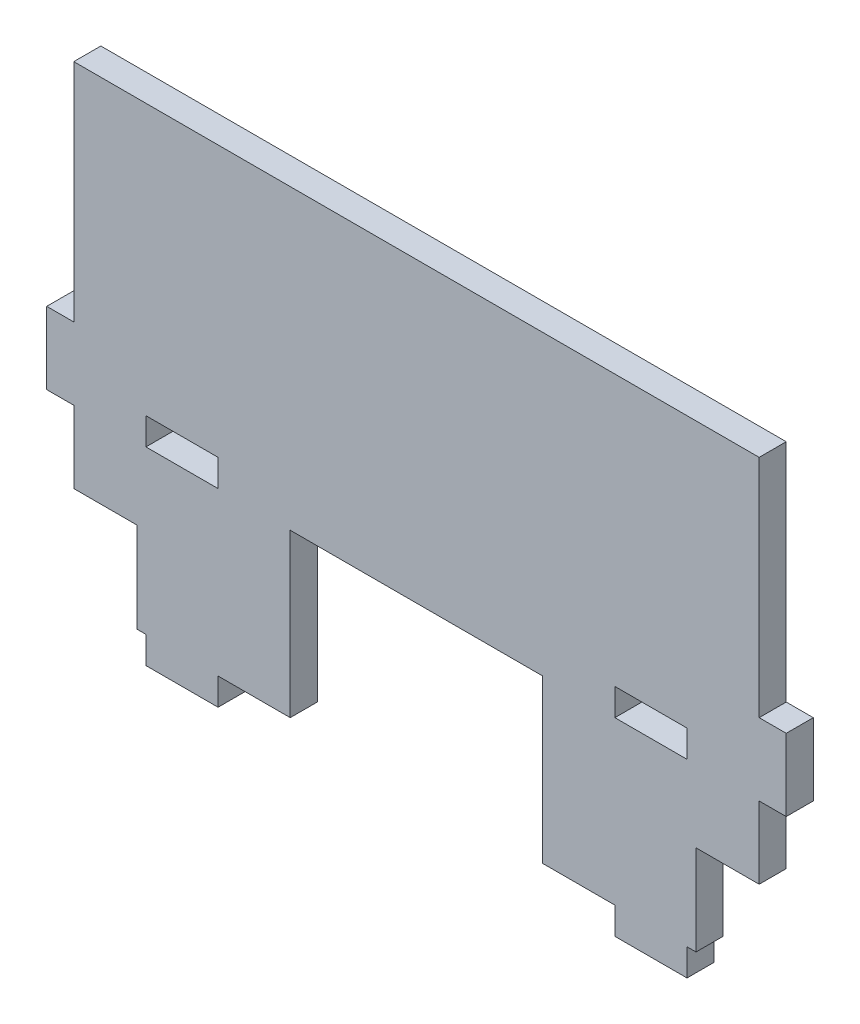
ISO-10303-21;
HEADER;
FILE_DESCRIPTION(('STEP AP214'),'2;1');
FILE_NAME('part.step','',(''),(''),'','','');
FILE_SCHEMA(('AUTOMOTIVE_DESIGN { 1 0 10303 214 1 1 1 1 }'));
ENDSEC;
DATA;
#1=APPLICATION_CONTEXT('core data for automotive mechanical design processes');
#2=APPLICATION_PROTOCOL_DEFINITION('international standard','automotive_design',2000,#1);
#3=PRODUCT_CONTEXT('',#1,'mechanical');
#4=PRODUCT('Part','Part','',(#3));
#5=PRODUCT_RELATED_PRODUCT_CATEGORY('part','',(#4));
#6=PRODUCT_DEFINITION_FORMATION('','',#4);
#7=PRODUCT_DEFINITION_CONTEXT('part definition',#1,'design');
#8=PRODUCT_DEFINITION('design','',#6,#7);
#9=PRODUCT_DEFINITION_SHAPE('','',#8);
#10=(LENGTH_UNIT() NAMED_UNIT(*) SI_UNIT(.MILLI.,.METRE.));
#11=(NAMED_UNIT(*) PLANE_ANGLE_UNIT() SI_UNIT($,.RADIAN.));
#12=(NAMED_UNIT(*) SI_UNIT($,.STERADIAN.) SOLID_ANGLE_UNIT());
#13=UNCERTAINTY_MEASURE_WITH_UNIT(LENGTH_MEASURE(1.E-05),#10,'distance_accuracy_value','');
#14=(GEOMETRIC_REPRESENTATION_CONTEXT(3) GLOBAL_UNCERTAINTY_ASSIGNED_CONTEXT((#13)) GLOBAL_UNIT_ASSIGNED_CONTEXT((#10,
#11,#12)) REPRESENTATION_CONTEXT('',''));
#15=CARTESIAN_POINT('',(0.,0.,0.));
#16=DIRECTION('',(0.,0.,1.));
#17=DIRECTION('',(1.,0.,0.));
#18=AXIS2_PLACEMENT_3D('',#15,#16,#17);
#19=CARTESIAN_POINT('',(0.,0.,3.));
#20=DIRECTION('',(0.,0.,-1.));
#21=DIRECTION('',(-1.,0.,0.));
#22=AXIS2_PLACEMENT_3D('',#19,#20,#21);
#23=PLANE('',#22);
#24=DIRECTION('',(1.,0.,0.));
#25=VECTOR('',#24,1.);
#26=CARTESIAN_POINT('',(30.,-33.,3.));
#27=LINE('',#26,#25);
#28=CARTESIAN_POINT('',(22.,-33.,3.));
#29=VERTEX_POINT('',#28);
#30=CARTESIAN_POINT('',(30.,-33.,3.));
#31=VERTEX_POINT('',#30);
#32=EDGE_CURVE('E301',#29,#31,#27,.T.);
#33=ORIENTED_EDGE('',*,*,#32,.F.);
#34=DIRECTION('',(0.,-1.,0.));
#35=VECTOR('',#34,1.);
#36=CARTESIAN_POINT('',(22.,-33.,3.));
#37=LINE('',#36,#35);
#38=CARTESIAN_POINT('',(22.,-30.,3.));
#39=VERTEX_POINT('',#38);
#40=EDGE_CURVE('E309',#39,#29,#37,.T.);
#41=ORIENTED_EDGE('',*,*,#40,.F.);
#42=DIRECTION('',(-1.,0.,0.));
#43=VECTOR('',#42,1.);
#44=CARTESIAN_POINT('',(30.,-30.,3.));
#45=LINE('',#44,#43);
#46=CARTESIAN_POINT('',(30.,-30.,3.));
#47=VERTEX_POINT('',#46);
#48=EDGE_CURVE('E306',#47,#39,#45,.T.);
#49=ORIENTED_EDGE('',*,*,#48,.F.);
#50=DIRECTION('',(0.,1.,0.));
#51=VECTOR('',#50,1.);
#52=CARTESIAN_POINT('',(30.,-33.,3.));
#53=LINE('',#52,#51);
#54=EDGE_CURVE('E303',#31,#47,#53,.T.);
#55=ORIENTED_EDGE('',*,*,#54,.F.);
#56=EDGE_LOOP('',(#33,#41,#49,#55));
#57=FACE_BOUND('',#56,.T.);
#58=DIRECTION('',(0.,-1.,0.));
#59=VECTOR('',#58,1.);
#60=CARTESIAN_POINT('',(-38.,0.,3.));
#61=LINE('',#60,#59);
#62=CARTESIAN_POINT('',(-38.,0.,3.));
#63=VERTEX_POINT('',#62);
#64=CARTESIAN_POINT('',(-38.,-25.,3.));
#65=VERTEX_POINT('',#64);
#66=EDGE_CURVE('E332',#63,#65,#61,.T.);
#67=ORIENTED_EDGE('',*,*,#66,.T.);
#68=DIRECTION('',(-1.,0.,0.));
#69=VECTOR('',#68,1.);
#70=CARTESIAN_POINT('',(-38.,-25.,3.));
#71=LINE('',#70,#69);
#72=CARTESIAN_POINT('',(-41.,-25.,3.));
#73=VERTEX_POINT('',#72);
#74=EDGE_CURVE('E335',#65,#73,#71,.T.);
#75=ORIENTED_EDGE('',*,*,#74,.T.);
#76=DIRECTION('',(0.,-1.,0.));
#77=VECTOR('',#76,1.);
#78=CARTESIAN_POINT('',(-41.,-25.,3.));
#79=LINE('',#78,#77);
#80=CARTESIAN_POINT('',(-41.,-33.,3.));
#81=VERTEX_POINT('',#80);
#82=EDGE_CURVE('E338',#73,#81,#79,.T.);
#83=ORIENTED_EDGE('',*,*,#82,.T.);
#84=DIRECTION('',(1.,0.,0.));
#85=VECTOR('',#84,1.);
#86=CARTESIAN_POINT('',(-41.,-33.,3.));
#87=LINE('',#86,#85);
#88=CARTESIAN_POINT('',(-38.,-33.,3.));
#89=VERTEX_POINT('',#88);
#90=EDGE_CURVE('E340',#81,#89,#87,.T.);
#91=ORIENTED_EDGE('',*,*,#90,.T.);
#92=DIRECTION('',(0.,-1.,0.));
#93=VECTOR('',#92,1.);
#94=CARTESIAN_POINT('',(-38.,-33.,3.));
#95=LINE('',#94,#93);
#96=CARTESIAN_POINT('',(-38.,-41.,3.));
#97=VERTEX_POINT('',#96);
#98=EDGE_CURVE('E342',#89,#97,#95,.T.);
#99=ORIENTED_EDGE('',*,*,#98,.T.);
#100=DIRECTION('',(1.,0.,0.));
#101=VECTOR('',#100,1.);
#102=CARTESIAN_POINT('',(-38.,-41.,3.));
#103=LINE('',#102,#101);
#104=CARTESIAN_POINT('',(-31.,-41.,3.));
#105=VERTEX_POINT('',#104);
#106=EDGE_CURVE('E344',#97,#105,#103,.T.);
#107=ORIENTED_EDGE('',*,*,#106,.T.);
#108=DIRECTION('',(0.,-1.,0.));
#109=VECTOR('',#108,1.);
#110=CARTESIAN_POINT('',(-31.,-41.,3.));
#111=LINE('',#110,#109);
#112=CARTESIAN_POINT('',(-31.,-51.,3.));
#113=VERTEX_POINT('',#112);
#114=EDGE_CURVE('E346',#105,#113,#111,.T.);
#115=ORIENTED_EDGE('',*,*,#114,.T.);
#116=DIRECTION('',(1.,0.,0.));
#117=VECTOR('',#116,1.);
#118=CARTESIAN_POINT('',(-31.,-51.,3.));
#119=LINE('',#118,#117);
#120=CARTESIAN_POINT('',(-30.,-51.,3.));
#121=VERTEX_POINT('',#120);
#122=EDGE_CURVE('E348',#113,#121,#119,.T.);
#123=ORIENTED_EDGE('',*,*,#122,.T.);
#124=DIRECTION('',(0.,-1.,0.));
#125=VECTOR('',#124,1.);
#126=CARTESIAN_POINT('',(-30.,-51.,3.));
#127=LINE('',#126,#125);
#128=CARTESIAN_POINT('',(-30.,-54.,3.));
#129=VERTEX_POINT('',#128);
#130=EDGE_CURVE('E350',#121,#129,#127,.T.);
#131=ORIENTED_EDGE('',*,*,#130,.T.);
#132=DIRECTION('',(1.,0.,0.));
#133=VECTOR('',#132,1.);
#134=CARTESIAN_POINT('',(-30.,-54.,3.));
#135=LINE('',#134,#133);
#136=CARTESIAN_POINT('',(-22.,-54.,3.));
#137=VERTEX_POINT('',#136);
#138=EDGE_CURVE('E352',#129,#137,#135,.T.);
#139=ORIENTED_EDGE('',*,*,#138,.T.);
#140=DIRECTION('',(0.,1.,0.));
#141=VECTOR('',#140,1.);
#142=CARTESIAN_POINT('',(-22.,-54.,3.));
#143=LINE('',#142,#141);
#144=CARTESIAN_POINT('',(-22.,-51.,3.));
#145=VERTEX_POINT('',#144);
#146=EDGE_CURVE('E354',#137,#145,#143,.T.);
#147=ORIENTED_EDGE('',*,*,#146,.T.);
#148=DIRECTION('',(1.,0.,0.));
#149=VECTOR('',#148,1.);
#150=CARTESIAN_POINT('',(-22.,-51.,3.));
#151=LINE('',#150,#149);
#152=CARTESIAN_POINT('',(-14.,-51.,3.));
#153=VERTEX_POINT('',#152);
#154=EDGE_CURVE('E356',#145,#153,#151,.T.);
#155=ORIENTED_EDGE('',*,*,#154,.T.);
#156=DIRECTION('',(0.,1.,0.));
#157=VECTOR('',#156,1.);
#158=CARTESIAN_POINT('',(-14.,-51.,3.));
#159=LINE('',#158,#157);
#160=CARTESIAN_POINT('',(-14.,-33.,3.));
#161=VERTEX_POINT('',#160);
#162=EDGE_CURVE('E358',#153,#161,#159,.T.);
#163=ORIENTED_EDGE('',*,*,#162,.T.);
#164=DIRECTION('',(1.,0.,0.));
#165=VECTOR('',#164,1.);
#166=CARTESIAN_POINT('',(-14.,-33.,3.));
#167=LINE('',#166,#165);
#168=CARTESIAN_POINT('',(14.,-33.,3.));
#169=VERTEX_POINT('',#168);
#170=EDGE_CURVE('E360',#161,#169,#167,.T.);
#171=ORIENTED_EDGE('',*,*,#170,.T.);
#172=DIRECTION('',(0.,-1.,0.));
#173=VECTOR('',#172,1.);
#174=CARTESIAN_POINT('',(14.,-51.,3.));
#175=LINE('',#174,#173);
#176=CARTESIAN_POINT('',(14.,-51.,3.));
#177=VERTEX_POINT('',#176);
#178=EDGE_CURVE('E362',#169,#177,#175,.T.);
#179=ORIENTED_EDGE('',*,*,#178,.T.);
#180=DIRECTION('',(1.,0.,0.));
#181=VECTOR('',#180,1.);
#182=CARTESIAN_POINT('',(22.,-51.,3.));
#183=LINE('',#182,#181);
#184=CARTESIAN_POINT('',(22.,-51.,3.));
#185=VERTEX_POINT('',#184);
#186=EDGE_CURVE('E364',#177,#185,#183,.T.);
#187=ORIENTED_EDGE('',*,*,#186,.T.);
#188=DIRECTION('',(0.,-1.,0.));
#189=VECTOR('',#188,1.);
#190=CARTESIAN_POINT('',(22.,-54.,3.));
#191=LINE('',#190,#189);
#192=CARTESIAN_POINT('',(22.,-54.,3.));
#193=VERTEX_POINT('',#192);
#194=EDGE_CURVE('E366',#185,#193,#191,.T.);
#195=ORIENTED_EDGE('',*,*,#194,.T.);
#196=DIRECTION('',(1.,0.,0.));
#197=VECTOR('',#196,1.);
#198=CARTESIAN_POINT('',(30.,-54.,3.));
#199=LINE('',#198,#197);
#200=CARTESIAN_POINT('',(30.,-54.,3.));
#201=VERTEX_POINT('',#200);
#202=EDGE_CURVE('E368',#193,#201,#199,.T.);
#203=ORIENTED_EDGE('',*,*,#202,.T.);
#204=DIRECTION('',(0.,1.,0.));
#205=VECTOR('',#204,1.);
#206=CARTESIAN_POINT('',(30.,-51.,3.));
#207=LINE('',#206,#205);
#208=CARTESIAN_POINT('',(30.,-51.,3.));
#209=VERTEX_POINT('',#208);
#210=EDGE_CURVE('E370',#201,#209,#207,.T.);
#211=ORIENTED_EDGE('',*,*,#210,.T.);
#212=DIRECTION('',(1.,0.,0.));
#213=VECTOR('',#212,1.);
#214=CARTESIAN_POINT('',(31.,-51.,3.));
#215=LINE('',#214,#213);
#216=CARTESIAN_POINT('',(31.,-51.,3.));
#217=VERTEX_POINT('',#216);
#218=EDGE_CURVE('E372',#209,#217,#215,.T.);
#219=ORIENTED_EDGE('',*,*,#218,.T.);
#220=DIRECTION('',(0.,1.,0.));
#221=VECTOR('',#220,1.);
#222=CARTESIAN_POINT('',(31.,-41.,3.));
#223=LINE('',#222,#221);
#224=CARTESIAN_POINT('',(31.,-41.,3.));
#225=VERTEX_POINT('',#224);
#226=EDGE_CURVE('E374',#217,#225,#223,.T.);
#227=ORIENTED_EDGE('',*,*,#226,.T.);
#228=DIRECTION('',(1.,0.,0.));
#229=VECTOR('',#228,1.);
#230=CARTESIAN_POINT('',(38.,-41.,3.));
#231=LINE('',#230,#229);
#232=CARTESIAN_POINT('',(38.,-41.,3.));
#233=VERTEX_POINT('',#232);
#234=EDGE_CURVE('E376',#225,#233,#231,.T.);
#235=ORIENTED_EDGE('',*,*,#234,.T.);
#236=DIRECTION('',(0.,1.,0.));
#237=VECTOR('',#236,1.);
#238=CARTESIAN_POINT('',(38.,-33.,3.));
#239=LINE('',#238,#237);
#240=CARTESIAN_POINT('',(38.,-33.,3.));
#241=VERTEX_POINT('',#240);
#242=EDGE_CURVE('E378',#233,#241,#239,.T.);
#243=ORIENTED_EDGE('',*,*,#242,.T.);
#244=DIRECTION('',(1.,0.,0.));
#245=VECTOR('',#244,1.);
#246=CARTESIAN_POINT('',(41.,-33.,3.));
#247=LINE('',#246,#245);
#248=CARTESIAN_POINT('',(41.,-33.,3.));
#249=VERTEX_POINT('',#248);
#250=EDGE_CURVE('E380',#241,#249,#247,.T.);
#251=ORIENTED_EDGE('',*,*,#250,.T.);
#252=DIRECTION('',(0.,1.,0.));
#253=VECTOR('',#252,1.);
#254=CARTESIAN_POINT('',(41.,-25.,3.));
#255=LINE('',#254,#253);
#256=CARTESIAN_POINT('',(41.,-25.,3.));
#257=VERTEX_POINT('',#256);
#258=EDGE_CURVE('E382',#249,#257,#255,.T.);
#259=ORIENTED_EDGE('',*,*,#258,.T.);
#260=DIRECTION('',(-1.,0.,0.));
#261=VECTOR('',#260,1.);
#262=CARTESIAN_POINT('',(38.,-25.,3.));
#263=LINE('',#262,#261);
#264=CARTESIAN_POINT('',(38.,-25.,3.));
#265=VERTEX_POINT('',#264);
#266=EDGE_CURVE('E384',#257,#265,#263,.T.);
#267=ORIENTED_EDGE('',*,*,#266,.T.);
#268=DIRECTION('',(0.,1.,0.));
#269=VECTOR('',#268,1.);
#270=CARTESIAN_POINT('',(38.,0.,3.));
#271=LINE('',#270,#269);
#272=CARTESIAN_POINT('',(38.,0.,3.));
#273=VERTEX_POINT('',#272);
#274=EDGE_CURVE('E386',#265,#273,#271,.T.);
#275=ORIENTED_EDGE('',*,*,#274,.T.);
#276=DIRECTION('',(-1.,0.,0.));
#277=VECTOR('',#276,1.);
#278=CARTESIAN_POINT('',(38.,0.,3.));
#279=LINE('',#278,#277);
#280=EDGE_CURVE('E388',#273,#63,#279,.T.);
#281=ORIENTED_EDGE('',*,*,#280,.T.);
#282=EDGE_LOOP('',(#67,#75,#83,#91,#99,#107,#115,#123,#131,#139,#147,#155,#163,#171,#179,#187,
#195,#203,#211,#219,#227,#235,#243,#251,#259,#267,#275,#281));
#283=FACE_BOUND('',#282,.T.);
#284=DIRECTION('',(0.,-1.,0.));
#285=VECTOR('',#284,1.);
#286=CARTESIAN_POINT('',(-30.,-33.,3.));
#287=LINE('',#286,#285);
#288=CARTESIAN_POINT('',(-30.,-30.,3.));
#289=VERTEX_POINT('',#288);
#290=CARTESIAN_POINT('',(-30.,-33.,3.));
#291=VERTEX_POINT('',#290);
#292=EDGE_CURVE('E265',#289,#291,#287,.T.);
#293=ORIENTED_EDGE('',*,*,#292,.F.);
#294=DIRECTION('',(-1.,0.,0.));
#295=VECTOR('',#294,1.);
#296=CARTESIAN_POINT('',(-30.,-30.,3.));
#297=LINE('',#296,#295);
#298=CARTESIAN_POINT('',(-22.,-30.,3.));
#299=VERTEX_POINT('',#298);
#300=EDGE_CURVE('E287',#299,#289,#297,.T.);
#301=ORIENTED_EDGE('',*,*,#300,.F.);
#302=DIRECTION('',(0.,1.,0.));
#303=VECTOR('',#302,1.);
#304=CARTESIAN_POINT('',(-22.,-33.,3.));
#305=LINE('',#304,#303);
#306=CARTESIAN_POINT('',(-22.,-33.,3.));
#307=VERTEX_POINT('',#306);
#308=EDGE_CURVE('E285',#307,#299,#305,.T.);
#309=ORIENTED_EDGE('',*,*,#308,.F.);
#310=DIRECTION('',(1.,0.,0.));
#311=VECTOR('',#310,1.);
#312=CARTESIAN_POINT('',(-30.,-33.,3.));
#313=LINE('',#312,#311);
#314=EDGE_CURVE('E273',#291,#307,#313,.T.);
#315=ORIENTED_EDGE('',*,*,#314,.F.);
#316=EDGE_LOOP('',(#293,#301,#309,#315));
#317=FACE_BOUND('',#316,.T.);
#318=ADVANCED_FACE('F32',(#57,#283,#317),#23,.F.);
#319=CARTESIAN_POINT('',(0.,0.,0.));
#320=DIRECTION('',(0.,0.,-1.));
#321=DIRECTION('',(-1.,0.,0.));
#322=AXIS2_PLACEMENT_3D('',#319,#320,#321);
#323=PLANE('',#322);
#324=DIRECTION('',(0.,-1.,0.));
#325=VECTOR('',#324,1.);
#326=CARTESIAN_POINT('',(22.,-33.,0.));
#327=LINE('',#326,#325);
#328=CARTESIAN_POINT('',(22.,-30.,0.));
#329=VERTEX_POINT('',#328);
#330=CARTESIAN_POINT('',(22.,-33.,0.));
#331=VERTEX_POINT('',#330);
#332=EDGE_CURVE('E304',#329,#331,#327,.T.);
#333=ORIENTED_EDGE('',*,*,#332,.T.);
#334=DIRECTION('',(1.,0.,0.));
#335=VECTOR('',#334,1.);
#336=CARTESIAN_POINT('',(30.,-33.,0.));
#337=LINE('',#336,#335);
#338=CARTESIAN_POINT('',(30.,-33.,0.));
#339=VERTEX_POINT('',#338);
#340=EDGE_CURVE('E281',#331,#339,#337,.T.);
#341=ORIENTED_EDGE('',*,*,#340,.T.);
#342=DIRECTION('',(0.,1.,0.));
#343=VECTOR('',#342,1.);
#344=CARTESIAN_POINT('',(30.,-33.,0.));
#345=LINE('',#344,#343);
#346=CARTESIAN_POINT('',(30.,-30.,0.));
#347=VERTEX_POINT('',#346);
#348=EDGE_CURVE('E314',#339,#347,#345,.T.);
#349=ORIENTED_EDGE('',*,*,#348,.T.);
#350=DIRECTION('',(-1.,0.,0.));
#351=VECTOR('',#350,1.);
#352=CARTESIAN_POINT('',(30.,-30.,0.));
#353=LINE('',#352,#351);
#354=EDGE_CURVE('E317',#347,#329,#353,.T.);
#355=ORIENTED_EDGE('',*,*,#354,.T.);
#356=EDGE_LOOP('',(#333,#341,#349,#355));
#357=FACE_BOUND('',#356,.T.);
#358=DIRECTION('',(0.,-1.,0.));
#359=VECTOR('',#358,1.);
#360=CARTESIAN_POINT('',(-38.,0.,0.));
#361=LINE('',#360,#359);
#362=CARTESIAN_POINT('',(-38.,0.,0.));
#363=VERTEX_POINT('',#362);
#364=CARTESIAN_POINT('',(-38.,-25.,0.));
#365=VERTEX_POINT('',#364);
#366=EDGE_CURVE('E331',#363,#365,#361,.T.);
#367=ORIENTED_EDGE('',*,*,#366,.F.);
#368=DIRECTION('',(-1.,0.,0.));
#369=VECTOR('',#368,1.);
#370=CARTESIAN_POINT('',(38.,0.,0.));
#371=LINE('',#370,#369);
#372=CARTESIAN_POINT('',(38.,0.,0.));
#373=VERTEX_POINT('',#372);
#374=EDGE_CURVE('E336',#373,#363,#371,.T.);
#375=ORIENTED_EDGE('',*,*,#374,.F.);
#376=DIRECTION('',(0.,1.,0.));
#377=VECTOR('',#376,1.);
#378=CARTESIAN_POINT('',(38.,0.,0.));
#379=LINE('',#378,#377);
#380=CARTESIAN_POINT('',(38.,-25.,0.));
#381=VERTEX_POINT('',#380);
#382=EDGE_CURVE('E443',#381,#373,#379,.T.);
#383=ORIENTED_EDGE('',*,*,#382,.F.);
#384=DIRECTION('',(-1.,0.,0.));
#385=VECTOR('',#384,1.);
#386=CARTESIAN_POINT('',(38.,-25.,0.));
#387=LINE('',#386,#385);
#388=CARTESIAN_POINT('',(41.,-25.,0.));
#389=VERTEX_POINT('',#388);
#390=EDGE_CURVE('E441',#389,#381,#387,.T.);
#391=ORIENTED_EDGE('',*,*,#390,.F.);
#392=DIRECTION('',(0.,1.,0.));
#393=VECTOR('',#392,1.);
#394=CARTESIAN_POINT('',(41.,-25.,0.));
#395=LINE('',#394,#393);
#396=CARTESIAN_POINT('',(41.,-33.,0.));
#397=VERTEX_POINT('',#396);
#398=EDGE_CURVE('E439',#397,#389,#395,.T.);
#399=ORIENTED_EDGE('',*,*,#398,.F.);
#400=DIRECTION('',(1.,0.,0.));
#401=VECTOR('',#400,1.);
#402=CARTESIAN_POINT('',(41.,-33.,0.));
#403=LINE('',#402,#401);
#404=CARTESIAN_POINT('',(38.,-33.,0.));
#405=VERTEX_POINT('',#404);
#406=EDGE_CURVE('E437',#405,#397,#403,.T.);
#407=ORIENTED_EDGE('',*,*,#406,.F.);
#408=DIRECTION('',(0.,1.,0.));
#409=VECTOR('',#408,1.);
#410=CARTESIAN_POINT('',(38.,-33.,0.));
#411=LINE('',#410,#409);
#412=CARTESIAN_POINT('',(38.,-41.,0.));
#413=VERTEX_POINT('',#412);
#414=EDGE_CURVE('E435',#413,#405,#411,.T.);
#415=ORIENTED_EDGE('',*,*,#414,.F.);
#416=DIRECTION('',(1.,0.,0.));
#417=VECTOR('',#416,1.);
#418=CARTESIAN_POINT('',(38.,-41.,0.));
#419=LINE('',#418,#417);
#420=CARTESIAN_POINT('',(31.,-41.,0.));
#421=VERTEX_POINT('',#420);
#422=EDGE_CURVE('E433',#421,#413,#419,.T.);
#423=ORIENTED_EDGE('',*,*,#422,.F.);
#424=DIRECTION('',(0.,1.,0.));
#425=VECTOR('',#424,1.);
#426=CARTESIAN_POINT('',(31.,-41.,0.));
#427=LINE('',#426,#425);
#428=CARTESIAN_POINT('',(31.,-51.,0.));
#429=VERTEX_POINT('',#428);
#430=EDGE_CURVE('E431',#429,#421,#427,.T.);
#431=ORIENTED_EDGE('',*,*,#430,.F.);
#432=DIRECTION('',(1.,0.,0.));
#433=VECTOR('',#432,1.);
#434=CARTESIAN_POINT('',(31.,-51.,0.));
#435=LINE('',#434,#433);
#436=CARTESIAN_POINT('',(30.,-51.,0.));
#437=VERTEX_POINT('',#436);
#438=EDGE_CURVE('E429',#437,#429,#435,.T.);
#439=ORIENTED_EDGE('',*,*,#438,.F.);
#440=DIRECTION('',(0.,1.,0.));
#441=VECTOR('',#440,1.);
#442=CARTESIAN_POINT('',(30.,-51.,0.));
#443=LINE('',#442,#441);
#444=CARTESIAN_POINT('',(30.,-54.,0.));
#445=VERTEX_POINT('',#444);
#446=EDGE_CURVE('E427',#445,#437,#443,.T.);
#447=ORIENTED_EDGE('',*,*,#446,.F.);
#448=DIRECTION('',(1.,0.,0.));
#449=VECTOR('',#448,1.);
#450=CARTESIAN_POINT('',(30.,-54.,0.));
#451=LINE('',#450,#449);
#452=CARTESIAN_POINT('',(22.,-54.,0.));
#453=VERTEX_POINT('',#452);
#454=EDGE_CURVE('E425',#453,#445,#451,.T.);
#455=ORIENTED_EDGE('',*,*,#454,.F.);
#456=DIRECTION('',(0.,-1.,0.));
#457=VECTOR('',#456,1.);
#458=CARTESIAN_POINT('',(22.,-54.,0.));
#459=LINE('',#458,#457);
#460=CARTESIAN_POINT('',(22.,-51.,0.));
#461=VERTEX_POINT('',#460);
#462=EDGE_CURVE('E423',#461,#453,#459,.T.);
#463=ORIENTED_EDGE('',*,*,#462,.F.);
#464=DIRECTION('',(1.,0.,0.));
#465=VECTOR('',#464,1.);
#466=CARTESIAN_POINT('',(22.,-51.,0.));
#467=LINE('',#466,#465);
#468=CARTESIAN_POINT('',(14.,-51.,0.));
#469=VERTEX_POINT('',#468);
#470=EDGE_CURVE('E421',#469,#461,#467,.T.);
#471=ORIENTED_EDGE('',*,*,#470,.F.);
#472=DIRECTION('',(0.,-1.,0.));
#473=VECTOR('',#472,1.);
#474=CARTESIAN_POINT('',(14.,-51.,0.));
#475=LINE('',#474,#473);
#476=CARTESIAN_POINT('',(14.,-33.,0.));
#477=VERTEX_POINT('',#476);
#478=EDGE_CURVE('E419',#477,#469,#475,.T.);
#479=ORIENTED_EDGE('',*,*,#478,.F.);
#480=DIRECTION('',(1.,0.,0.));
#481=VECTOR('',#480,1.);
#482=CARTESIAN_POINT('',(-14.,-33.,0.));
#483=LINE('',#482,#481);
#484=CARTESIAN_POINT('',(-14.,-33.,0.));
#485=VERTEX_POINT('',#484);
#486=EDGE_CURVE('E417',#485,#477,#483,.T.);
#487=ORIENTED_EDGE('',*,*,#486,.F.);
#488=DIRECTION('',(0.,1.,0.));
#489=VECTOR('',#488,1.);
#490=CARTESIAN_POINT('',(-14.,-51.,0.));
#491=LINE('',#490,#489);
#492=CARTESIAN_POINT('',(-14.,-51.,0.));
#493=VERTEX_POINT('',#492);
#494=EDGE_CURVE('E415',#493,#485,#491,.T.);
#495=ORIENTED_EDGE('',*,*,#494,.F.);
#496=DIRECTION('',(1.,0.,0.));
#497=VECTOR('',#496,1.);
#498=CARTESIAN_POINT('',(-22.,-51.,0.));
#499=LINE('',#498,#497);
#500=CARTESIAN_POINT('',(-22.,-51.,0.));
#501=VERTEX_POINT('',#500);
#502=EDGE_CURVE('E413',#501,#493,#499,.T.);
#503=ORIENTED_EDGE('',*,*,#502,.F.);
#504=DIRECTION('',(0.,1.,0.));
#505=VECTOR('',#504,1.);
#506=CARTESIAN_POINT('',(-22.,-54.,0.));
#507=LINE('',#506,#505);
#508=CARTESIAN_POINT('',(-22.,-54.,0.));
#509=VERTEX_POINT('',#508);
#510=EDGE_CURVE('E411',#509,#501,#507,.T.);
#511=ORIENTED_EDGE('',*,*,#510,.F.);
#512=DIRECTION('',(1.,0.,0.));
#513=VECTOR('',#512,1.);
#514=CARTESIAN_POINT('',(-30.,-54.,0.));
#515=LINE('',#514,#513);
#516=CARTESIAN_POINT('',(-30.,-54.,0.));
#517=VERTEX_POINT('',#516);
#518=EDGE_CURVE('E409',#517,#509,#515,.T.);
#519=ORIENTED_EDGE('',*,*,#518,.F.);
#520=DIRECTION('',(0.,-1.,0.));
#521=VECTOR('',#520,1.);
#522=CARTESIAN_POINT('',(-30.,-51.,0.));
#523=LINE('',#522,#521);
#524=CARTESIAN_POINT('',(-30.,-51.,0.));
#525=VERTEX_POINT('',#524);
#526=EDGE_CURVE('E407',#525,#517,#523,.T.);
#527=ORIENTED_EDGE('',*,*,#526,.F.);
#528=DIRECTION('',(1.,0.,0.));
#529=VECTOR('',#528,1.);
#530=CARTESIAN_POINT('',(-31.,-51.,0.));
#531=LINE('',#530,#529);
#532=CARTESIAN_POINT('',(-31.,-51.,0.));
#533=VERTEX_POINT('',#532);
#534=EDGE_CURVE('E405',#533,#525,#531,.T.);
#535=ORIENTED_EDGE('',*,*,#534,.F.);
#536=DIRECTION('',(0.,-1.,0.));
#537=VECTOR('',#536,1.);
#538=CARTESIAN_POINT('',(-31.,-41.,0.));
#539=LINE('',#538,#537);
#540=CARTESIAN_POINT('',(-31.,-41.,0.));
#541=VERTEX_POINT('',#540);
#542=EDGE_CURVE('E403',#541,#533,#539,.T.);
#543=ORIENTED_EDGE('',*,*,#542,.F.);
#544=DIRECTION('',(1.,0.,0.));
#545=VECTOR('',#544,1.);
#546=CARTESIAN_POINT('',(-38.,-41.,0.));
#547=LINE('',#546,#545);
#548=CARTESIAN_POINT('',(-38.,-41.,0.));
#549=VERTEX_POINT('',#548);
#550=EDGE_CURVE('E401',#549,#541,#547,.T.);
#551=ORIENTED_EDGE('',*,*,#550,.F.);
#552=DIRECTION('',(0.,-1.,0.));
#553=VECTOR('',#552,1.);
#554=CARTESIAN_POINT('',(-38.,-33.,0.));
#555=LINE('',#554,#553);
#556=CARTESIAN_POINT('',(-38.,-33.,0.));
#557=VERTEX_POINT('',#556);
#558=EDGE_CURVE('E399',#557,#549,#555,.T.);
#559=ORIENTED_EDGE('',*,*,#558,.F.);
#560=DIRECTION('',(1.,0.,0.));
#561=VECTOR('',#560,1.);
#562=CARTESIAN_POINT('',(-41.,-33.,0.));
#563=LINE('',#562,#561);
#564=CARTESIAN_POINT('',(-41.,-33.,0.));
#565=VERTEX_POINT('',#564);
#566=EDGE_CURVE('E397',#565,#557,#563,.T.);
#567=ORIENTED_EDGE('',*,*,#566,.F.);
#568=DIRECTION('',(0.,-1.,0.));
#569=VECTOR('',#568,1.);
#570=CARTESIAN_POINT('',(-41.,-25.,0.));
#571=LINE('',#570,#569);
#572=CARTESIAN_POINT('',(-41.,-25.,0.));
#573=VERTEX_POINT('',#572);
#574=EDGE_CURVE('E395',#573,#565,#571,.T.);
#575=ORIENTED_EDGE('',*,*,#574,.F.);
#576=DIRECTION('',(-1.,0.,0.));
#577=VECTOR('',#576,1.);
#578=CARTESIAN_POINT('',(-38.,-25.,0.));
#579=LINE('',#578,#577);
#580=EDGE_CURVE('E393',#365,#573,#579,.T.);
#581=ORIENTED_EDGE('',*,*,#580,.F.);
#582=EDGE_LOOP('',(#367,#375,#383,#391,#399,#407,#415,#423,#431,#439,#447,#455,#463,#471,#479,
#487,#495,#503,#511,#519,#527,#535,#543,#551,#559,#567,#575,#581));
#583=FACE_BOUND('',#582,.T.);
#584=DIRECTION('',(-1.,0.,0.));
#585=VECTOR('',#584,1.);
#586=CARTESIAN_POINT('',(-30.,-30.,0.));
#587=LINE('',#586,#585);
#588=CARTESIAN_POINT('',(-22.,-30.,0.));
#589=VERTEX_POINT('',#588);
#590=CARTESIAN_POINT('',(-30.,-30.,0.));
#591=VERTEX_POINT('',#590);
#592=EDGE_CURVE('E274',#589,#591,#587,.T.);
#593=ORIENTED_EDGE('',*,*,#592,.T.);
#594=DIRECTION('',(0.,-1.,0.));
#595=VECTOR('',#594,1.);
#596=CARTESIAN_POINT('',(-30.,-33.,0.));
#597=LINE('',#596,#595);
#598=CARTESIAN_POINT('',(-30.,-33.,0.));
#599=VERTEX_POINT('',#598);
#600=EDGE_CURVE('E55',#591,#599,#597,.T.);
#601=ORIENTED_EDGE('',*,*,#600,.T.);
#602=DIRECTION('',(1.,0.,0.));
#603=VECTOR('',#602,1.);
#604=CARTESIAN_POINT('',(-30.,-33.,0.));
#605=LINE('',#604,#603);
#606=CARTESIAN_POINT('',(-22.,-33.,0.));
#607=VERTEX_POINT('',#606);
#608=EDGE_CURVE('E280',#599,#607,#605,.T.);
#609=ORIENTED_EDGE('',*,*,#608,.T.);
#610=DIRECTION('',(0.,1.,0.));
#611=VECTOR('',#610,1.);
#612=CARTESIAN_POINT('',(-22.,-33.,0.));
#613=LINE('',#612,#611);
#614=EDGE_CURVE('E293',#607,#589,#613,.T.);
#615=ORIENTED_EDGE('',*,*,#614,.T.);
#616=EDGE_LOOP('',(#593,#601,#609,#615));
#617=FACE_BOUND('',#616,.T.);
#618=ADVANCED_FACE('F533',(#357,#583,#617),#323,.T.);
#619=CARTESIAN_POINT('',(-38.,0.,3.));
#620=DIRECTION('',(1.,0.,0.));
#621=DIRECTION('',(0.,1.,0.));
#622=AXIS2_PLACEMENT_3D('',#619,#620,#621);
#623=PLANE('',#622);
#624=ORIENTED_EDGE('',*,*,#366,.T.);
#625=DIRECTION('',(0.,0.,-1.));
#626=VECTOR('',#625,1.);
#627=CARTESIAN_POINT('',(-38.,-25.,3.));
#628=LINE('',#627,#626);
#629=EDGE_CURVE('E11',#65,#365,#628,.T.);
#630=ORIENTED_EDGE('',*,*,#629,.F.);
#631=ORIENTED_EDGE('',*,*,#66,.F.);
#632=DIRECTION('',(0.,0.,-1.));
#633=VECTOR('',#632,1.);
#634=CARTESIAN_POINT('',(-38.,0.,3.));
#635=LINE('',#634,#633);
#636=EDGE_CURVE('E390',#63,#363,#635,.T.);
#637=ORIENTED_EDGE('',*,*,#636,.T.);
#638=EDGE_LOOP('',(#624,#630,#631,#637));
#639=FACE_BOUND('',#638,.T.);
#640=ADVANCED_FACE('F34',(#639),#623,.F.);
#641=CARTESIAN_POINT('',(-38.,-25.,3.));
#642=DIRECTION('',(0.,-1.,0.));
#643=DIRECTION('',(0.,0.,-1.));
#644=AXIS2_PLACEMENT_3D('',#641,#642,#643);
#645=PLANE('',#644);
#646=ORIENTED_EDGE('',*,*,#580,.T.);
#647=DIRECTION('',(0.,0.,-1.));
#648=VECTOR('',#647,1.);
#649=CARTESIAN_POINT('',(-41.,-25.,3.));
#650=LINE('',#649,#648);
#651=EDGE_CURVE('E40',#73,#573,#650,.T.);
#652=ORIENTED_EDGE('',*,*,#651,.F.);
#653=ORIENTED_EDGE('',*,*,#74,.F.);
#654=ORIENTED_EDGE('',*,*,#629,.T.);
#655=EDGE_LOOP('',(#646,#652,#653,#654));
#656=FACE_BOUND('',#655,.T.);
#657=ADVANCED_FACE('F550',(#656),#645,.F.);
#658=CARTESIAN_POINT('',(-41.,-25.,3.));
#659=DIRECTION('',(1.,0.,0.));
#660=DIRECTION('',(0.,1.,0.));
#661=AXIS2_PLACEMENT_3D('',#658,#659,#660);
#662=PLANE('',#661);
#663=ORIENTED_EDGE('',*,*,#574,.T.);
#664=DIRECTION('',(0.,0.,-1.));
#665=VECTOR('',#664,1.);
#666=CARTESIAN_POINT('',(-41.,-33.,3.));
#667=LINE('',#666,#665);
#668=EDGE_CURVE('E520',#81,#565,#667,.T.);
#669=ORIENTED_EDGE('',*,*,#668,.F.);
#670=ORIENTED_EDGE('',*,*,#82,.F.);
#671=ORIENTED_EDGE('',*,*,#651,.T.);
#672=EDGE_LOOP('',(#663,#669,#670,#671));
#673=FACE_BOUND('',#672,.T.);
#674=ADVANCED_FACE('F527',(#673),#662,.F.);
#675=CARTESIAN_POINT('',(-41.,-33.,3.));
#676=DIRECTION('',(0.,1.,0.));
#677=DIRECTION('',(0.,0.,1.));
#678=AXIS2_PLACEMENT_3D('',#675,#676,#677);
#679=PLANE('',#678);
#680=ORIENTED_EDGE('',*,*,#566,.T.);
#681=DIRECTION('',(0.,0.,-1.));
#682=VECTOR('',#681,1.);
#683=CARTESIAN_POINT('',(-38.,-33.,3.));
#684=LINE('',#683,#682);
#685=EDGE_CURVE('E517',#89,#557,#684,.T.);
#686=ORIENTED_EDGE('',*,*,#685,.F.);
#687=ORIENTED_EDGE('',*,*,#90,.F.);
#688=ORIENTED_EDGE('',*,*,#668,.T.);
#689=EDGE_LOOP('',(#680,#686,#687,#688));
#690=FACE_BOUND('',#689,.T.);
#691=ADVANCED_FACE('F539',(#690),#679,.F.);
#692=CARTESIAN_POINT('',(-38.,-33.,3.));
#693=DIRECTION('',(1.,0.,0.));
#694=DIRECTION('',(0.,1.,0.));
#695=AXIS2_PLACEMENT_3D('',#692,#693,#694);
#696=PLANE('',#695);
#697=ORIENTED_EDGE('',*,*,#558,.T.);
#698=DIRECTION('',(0.,0.,-1.));
#699=VECTOR('',#698,1.);
#700=CARTESIAN_POINT('',(-38.,-41.,3.));
#701=LINE('',#700,#699);
#702=EDGE_CURVE('E514',#97,#549,#701,.T.);
#703=ORIENTED_EDGE('',*,*,#702,.F.);
#704=ORIENTED_EDGE('',*,*,#98,.F.);
#705=ORIENTED_EDGE('',*,*,#685,.T.);
#706=EDGE_LOOP('',(#697,#703,#704,#705));
#707=FACE_BOUND('',#706,.T.);
#708=ADVANCED_FACE('F543',(#707),#696,.F.);
#709=CARTESIAN_POINT('',(-38.,-41.,3.));
#710=DIRECTION('',(0.,1.,0.));
#711=DIRECTION('',(0.,0.,1.));
#712=AXIS2_PLACEMENT_3D('',#709,#710,#711);
#713=PLANE('',#712);
#714=ORIENTED_EDGE('',*,*,#550,.T.);
#715=DIRECTION('',(0.,0.,-1.));
#716=VECTOR('',#715,1.);
#717=CARTESIAN_POINT('',(-31.,-41.,3.));
#718=LINE('',#717,#716);
#719=EDGE_CURVE('E511',#105,#541,#718,.T.);
#720=ORIENTED_EDGE('',*,*,#719,.F.);
#721=ORIENTED_EDGE('',*,*,#106,.F.);
#722=ORIENTED_EDGE('',*,*,#702,.T.);
#723=EDGE_LOOP('',(#714,#720,#721,#722));
#724=FACE_BOUND('',#723,.T.);
#725=ADVANCED_FACE('F663',(#724),#713,.F.);
#726=CARTESIAN_POINT('',(-31.,-41.,3.));
#727=DIRECTION('',(1.,0.,0.));
#728=DIRECTION('',(0.,1.,0.));
#729=AXIS2_PLACEMENT_3D('',#726,#727,#728);
#730=PLANE('',#729);
#731=ORIENTED_EDGE('',*,*,#542,.T.);
#732=DIRECTION('',(0.,0.,-1.));
#733=VECTOR('',#732,1.);
#734=CARTESIAN_POINT('',(-31.,-51.,3.));
#735=LINE('',#734,#733);
#736=EDGE_CURVE('E508',#113,#533,#735,.T.);
#737=ORIENTED_EDGE('',*,*,#736,.F.);
#738=ORIENTED_EDGE('',*,*,#114,.F.);
#739=ORIENTED_EDGE('',*,*,#719,.T.);
#740=EDGE_LOOP('',(#731,#737,#738,#739));
#741=FACE_BOUND('',#740,.T.);
#742=ADVANCED_FACE('F660',(#741),#730,.F.);
#743=CARTESIAN_POINT('',(-31.,-51.,3.));
#744=DIRECTION('',(0.,1.,0.));
#745=DIRECTION('',(0.,0.,1.));
#746=AXIS2_PLACEMENT_3D('',#743,#744,#745);
#747=PLANE('',#746);
#748=ORIENTED_EDGE('',*,*,#534,.T.);
#749=DIRECTION('',(0.,0.,-1.));
#750=VECTOR('',#749,1.);
#751=CARTESIAN_POINT('',(-30.,-51.,3.));
#752=LINE('',#751,#750);
#753=EDGE_CURVE('E505',#121,#525,#752,.T.);
#754=ORIENTED_EDGE('',*,*,#753,.F.);
#755=ORIENTED_EDGE('',*,*,#122,.F.);
#756=ORIENTED_EDGE('',*,*,#736,.T.);
#757=EDGE_LOOP('',(#748,#754,#755,#756));
#758=FACE_BOUND('',#757,.T.);
#759=ADVANCED_FACE('F656',(#758),#747,.F.);
#760=CARTESIAN_POINT('',(-30.,-51.,3.));
#761=DIRECTION('',(1.,0.,0.));
#762=DIRECTION('',(0.,0.,-1.));
#763=AXIS2_PLACEMENT_3D('',#760,#761,#762);
#764=PLANE('',#763);
#765=ORIENTED_EDGE('',*,*,#526,.T.);
#766=DIRECTION('',(0.,0.,-1.));
#767=VECTOR('',#766,1.);
#768=CARTESIAN_POINT('',(-30.,-54.,3.));
#769=LINE('',#768,#767);
#770=EDGE_CURVE('E502',#129,#517,#769,.T.);
#771=ORIENTED_EDGE('',*,*,#770,.F.);
#772=ORIENTED_EDGE('',*,*,#130,.F.);
#773=ORIENTED_EDGE('',*,*,#753,.T.);
#774=EDGE_LOOP('',(#765,#771,#772,#773));
#775=FACE_BOUND('',#774,.T.);
#776=ADVANCED_FACE('F652',(#775),#764,.F.);
#777=CARTESIAN_POINT('',(-30.,-54.,3.));
#778=DIRECTION('',(0.,1.,0.));
#779=DIRECTION('',(0.,0.,1.));
#780=AXIS2_PLACEMENT_3D('',#777,#778,#779);
#781=PLANE('',#780);
#782=ORIENTED_EDGE('',*,*,#518,.T.);
#783=DIRECTION('',(0.,0.,-1.));
#784=VECTOR('',#783,1.);
#785=CARTESIAN_POINT('',(-22.,-54.,3.));
#786=LINE('',#785,#784);
#787=EDGE_CURVE('E499',#137,#509,#786,.T.);
#788=ORIENTED_EDGE('',*,*,#787,.F.);
#789=ORIENTED_EDGE('',*,*,#138,.F.);
#790=ORIENTED_EDGE('',*,*,#770,.T.);
#791=EDGE_LOOP('',(#782,#788,#789,#790));
#792=FACE_BOUND('',#791,.T.);
#793=ADVANCED_FACE('F647',(#792),#781,.F.);
#794=CARTESIAN_POINT('',(-22.,-54.,3.));
#795=DIRECTION('',(-1.,0.,0.));
#796=DIRECTION('',(0.,0.,1.));
#797=AXIS2_PLACEMENT_3D('',#794,#795,#796);
#798=PLANE('',#797);
#799=ORIENTED_EDGE('',*,*,#510,.T.);
#800=DIRECTION('',(0.,0.,-1.));
#801=VECTOR('',#800,1.);
#802=CARTESIAN_POINT('',(-22.,-51.,3.));
#803=LINE('',#802,#801);
#804=EDGE_CURVE('E496',#145,#501,#803,.T.);
#805=ORIENTED_EDGE('',*,*,#804,.F.);
#806=ORIENTED_EDGE('',*,*,#146,.F.);
#807=ORIENTED_EDGE('',*,*,#787,.T.);
#808=EDGE_LOOP('',(#799,#805,#806,#807));
#809=FACE_BOUND('',#808,.T.);
#810=ADVANCED_FACE('F641',(#809),#798,.F.);
#811=CARTESIAN_POINT('',(-22.,-51.,3.));
#812=DIRECTION('',(0.,1.,0.));
#813=DIRECTION('',(0.,0.,1.));
#814=AXIS2_PLACEMENT_3D('',#811,#812,#813);
#815=PLANE('',#814);
#816=ORIENTED_EDGE('',*,*,#502,.T.);
#817=DIRECTION('',(0.,0.,-1.));
#818=VECTOR('',#817,1.);
#819=CARTESIAN_POINT('',(-14.,-51.,3.));
#820=LINE('',#819,#818);
#821=EDGE_CURVE('E493',#153,#493,#820,.T.);
#822=ORIENTED_EDGE('',*,*,#821,.F.);
#823=ORIENTED_EDGE('',*,*,#154,.F.);
#824=ORIENTED_EDGE('',*,*,#804,.T.);
#825=EDGE_LOOP('',(#816,#822,#823,#824));
#826=FACE_BOUND('',#825,.T.);
#827=ADVANCED_FACE('F637',(#826),#815,.F.);
#828=CARTESIAN_POINT('',(-14.,-51.,3.));
#829=DIRECTION('',(-1.,0.,0.));
#830=DIRECTION('',(0.,0.,1.));
#831=AXIS2_PLACEMENT_3D('',#828,#829,#830);
#832=PLANE('',#831);
#833=ORIENTED_EDGE('',*,*,#494,.T.);
#834=DIRECTION('',(0.,0.,-1.));
#835=VECTOR('',#834,1.);
#836=CARTESIAN_POINT('',(-14.,-33.,3.));
#837=LINE('',#836,#835);
#838=EDGE_CURVE('E490',#161,#485,#837,.T.);
#839=ORIENTED_EDGE('',*,*,#838,.F.);
#840=ORIENTED_EDGE('',*,*,#162,.F.);
#841=ORIENTED_EDGE('',*,*,#821,.T.);
#842=EDGE_LOOP('',(#833,#839,#840,#841));
#843=FACE_BOUND('',#842,.T.);
#844=ADVANCED_FACE('F632',(#843),#832,.F.);
#845=CARTESIAN_POINT('',(-14.,-33.,3.));
#846=DIRECTION('',(0.,1.,0.));
#847=DIRECTION('',(0.,0.,1.));
#848=AXIS2_PLACEMENT_3D('',#845,#846,#847);
#849=PLANE('',#848);
#850=ORIENTED_EDGE('',*,*,#486,.T.);
#851=DIRECTION('',(0.,0.,-1.));
#852=VECTOR('',#851,1.);
#853=CARTESIAN_POINT('',(14.,-33.,3.));
#854=LINE('',#853,#852);
#855=EDGE_CURVE('E487',#169,#477,#854,.T.);
#856=ORIENTED_EDGE('',*,*,#855,.F.);
#857=ORIENTED_EDGE('',*,*,#170,.F.);
#858=ORIENTED_EDGE('',*,*,#838,.T.);
#859=EDGE_LOOP('',(#850,#856,#857,#858));
#860=FACE_BOUND('',#859,.T.);
#861=ADVANCED_FACE('F626',(#860),#849,.F.);
#862=CARTESIAN_POINT('',(14.,-51.,3.));
#863=DIRECTION('',(1.,0.,0.));
#864=DIRECTION('',(0.,0.,-1.));
#865=AXIS2_PLACEMENT_3D('',#862,#863,#864);
#866=PLANE('',#865);
#867=ORIENTED_EDGE('',*,*,#478,.T.);
#868=DIRECTION('',(0.,0.,-1.));
#869=VECTOR('',#868,1.);
#870=CARTESIAN_POINT('',(14.,-51.,3.));
#871=LINE('',#870,#869);
#872=EDGE_CURVE('E484',#177,#469,#871,.T.);
#873=ORIENTED_EDGE('',*,*,#872,.F.);
#874=ORIENTED_EDGE('',*,*,#178,.F.);
#875=ORIENTED_EDGE('',*,*,#855,.T.);
#876=EDGE_LOOP('',(#867,#873,#874,#875));
#877=FACE_BOUND('',#876,.T.);
#878=ADVANCED_FACE('F622',(#877),#866,.F.);
#879=CARTESIAN_POINT('',(22.,-51.,3.));
#880=DIRECTION('',(0.,1.,0.));
#881=DIRECTION('',(0.,0.,1.));
#882=AXIS2_PLACEMENT_3D('',#879,#880,#881);
#883=PLANE('',#882);
#884=ORIENTED_EDGE('',*,*,#470,.T.);
#885=DIRECTION('',(0.,0.,-1.));
#886=VECTOR('',#885,1.);
#887=CARTESIAN_POINT('',(22.,-51.,3.));
#888=LINE('',#887,#886);
#889=EDGE_CURVE('E481',#185,#461,#888,.T.);
#890=ORIENTED_EDGE('',*,*,#889,.F.);
#891=ORIENTED_EDGE('',*,*,#186,.F.);
#892=ORIENTED_EDGE('',*,*,#872,.T.);
#893=EDGE_LOOP('',(#884,#890,#891,#892));
#894=FACE_BOUND('',#893,.T.);
#895=ADVANCED_FACE('F617',(#894),#883,.F.);
#896=CARTESIAN_POINT('',(22.,-54.,3.));
#897=DIRECTION('',(1.,0.,0.));
#898=DIRECTION('',(0.,0.,-1.));
#899=AXIS2_PLACEMENT_3D('',#896,#897,#898);
#900=PLANE('',#899);
#901=ORIENTED_EDGE('',*,*,#462,.T.);
#902=DIRECTION('',(0.,0.,-1.));
#903=VECTOR('',#902,1.);
#904=CARTESIAN_POINT('',(22.,-54.,3.));
#905=LINE('',#904,#903);
#906=EDGE_CURVE('E478',#193,#453,#905,.T.);
#907=ORIENTED_EDGE('',*,*,#906,.F.);
#908=ORIENTED_EDGE('',*,*,#194,.F.);
#909=ORIENTED_EDGE('',*,*,#889,.T.);
#910=EDGE_LOOP('',(#901,#907,#908,#909));
#911=FACE_BOUND('',#910,.T.);
#912=ADVANCED_FACE('F611',(#911),#900,.F.);
#913=CARTESIAN_POINT('',(30.,-54.,3.));
#914=DIRECTION('',(0.,1.,0.));
#915=DIRECTION('',(0.,0.,1.));
#916=AXIS2_PLACEMENT_3D('',#913,#914,#915);
#917=PLANE('',#916);
#918=ORIENTED_EDGE('',*,*,#454,.T.);
#919=DIRECTION('',(0.,0.,-1.));
#920=VECTOR('',#919,1.);
#921=CARTESIAN_POINT('',(30.,-54.,3.));
#922=LINE('',#921,#920);
#923=EDGE_CURVE('E475',#201,#445,#922,.T.);
#924=ORIENTED_EDGE('',*,*,#923,.F.);
#925=ORIENTED_EDGE('',*,*,#202,.F.);
#926=ORIENTED_EDGE('',*,*,#906,.T.);
#927=EDGE_LOOP('',(#918,#924,#925,#926));
#928=FACE_BOUND('',#927,.T.);
#929=ADVANCED_FACE('F607',(#928),#917,.F.);
#930=CARTESIAN_POINT('',(30.,-51.,3.));
#931=DIRECTION('',(-1.,0.,0.));
#932=DIRECTION('',(0.,0.,1.));
#933=AXIS2_PLACEMENT_3D('',#930,#931,#932);
#934=PLANE('',#933);
#935=ORIENTED_EDGE('',*,*,#446,.T.);
#936=DIRECTION('',(0.,0.,-1.));
#937=VECTOR('',#936,1.);
#938=CARTESIAN_POINT('',(30.,-51.,3.));
#939=LINE('',#938,#937);
#940=EDGE_CURVE('E472',#209,#437,#939,.T.);
#941=ORIENTED_EDGE('',*,*,#940,.F.);
#942=ORIENTED_EDGE('',*,*,#210,.F.);
#943=ORIENTED_EDGE('',*,*,#923,.T.);
#944=EDGE_LOOP('',(#935,#941,#942,#943));
#945=FACE_BOUND('',#944,.T.);
#946=ADVANCED_FACE('F602',(#945),#934,.F.);
#947=CARTESIAN_POINT('',(31.,-51.,3.));
#948=DIRECTION('',(0.,1.,0.));
#949=DIRECTION('',(0.,0.,1.));
#950=AXIS2_PLACEMENT_3D('',#947,#948,#949);
#951=PLANE('',#950);
#952=ORIENTED_EDGE('',*,*,#438,.T.);
#953=DIRECTION('',(0.,0.,-1.));
#954=VECTOR('',#953,1.);
#955=CARTESIAN_POINT('',(31.,-51.,3.));
#956=LINE('',#955,#954);
#957=EDGE_CURVE('E469',#217,#429,#956,.T.);
#958=ORIENTED_EDGE('',*,*,#957,.F.);
#959=ORIENTED_EDGE('',*,*,#218,.F.);
#960=ORIENTED_EDGE('',*,*,#940,.T.);
#961=EDGE_LOOP('',(#952,#958,#959,#960));
#962=FACE_BOUND('',#961,.T.);
#963=ADVANCED_FACE('F596',(#962),#951,.F.);
#964=CARTESIAN_POINT('',(31.,-41.,3.));
#965=DIRECTION('',(-1.,0.,0.));
#966=DIRECTION('',(0.,-1.,0.));
#967=AXIS2_PLACEMENT_3D('',#964,#965,#966);
#968=PLANE('',#967);
#969=ORIENTED_EDGE('',*,*,#430,.T.);
#970=DIRECTION('',(0.,0.,-1.));
#971=VECTOR('',#970,1.);
#972=CARTESIAN_POINT('',(31.,-41.,3.));
#973=LINE('',#972,#971);
#974=EDGE_CURVE('E466',#225,#421,#973,.T.);
#975=ORIENTED_EDGE('',*,*,#974,.F.);
#976=ORIENTED_EDGE('',*,*,#226,.F.);
#977=ORIENTED_EDGE('',*,*,#957,.T.);
#978=EDGE_LOOP('',(#969,#975,#976,#977));
#979=FACE_BOUND('',#978,.T.);
#980=ADVANCED_FACE('F592',(#979),#968,.F.);
#981=CARTESIAN_POINT('',(38.,-41.,3.));
#982=DIRECTION('',(0.,1.,0.));
#983=DIRECTION('',(0.,0.,1.));
#984=AXIS2_PLACEMENT_3D('',#981,#982,#983);
#985=PLANE('',#984);
#986=ORIENTED_EDGE('',*,*,#422,.T.);
#987=DIRECTION('',(0.,0.,-1.));
#988=VECTOR('',#987,1.);
#989=CARTESIAN_POINT('',(38.,-41.,3.));
#990=LINE('',#989,#988);
#991=EDGE_CURVE('E463',#233,#413,#990,.T.);
#992=ORIENTED_EDGE('',*,*,#991,.F.);
#993=ORIENTED_EDGE('',*,*,#234,.F.);
#994=ORIENTED_EDGE('',*,*,#974,.T.);
#995=EDGE_LOOP('',(#986,#992,#993,#994));
#996=FACE_BOUND('',#995,.T.);
#997=ADVANCED_FACE('F587',(#996),#985,.F.);
#998=CARTESIAN_POINT('',(38.,-33.,3.));
#999=DIRECTION('',(-1.,0.,0.));
#1000=DIRECTION('',(0.,-1.,0.));
#1001=AXIS2_PLACEMENT_3D('',#998,#999,#1000);
#1002=PLANE('',#1001);
#1003=ORIENTED_EDGE('',*,*,#414,.T.);
#1004=DIRECTION('',(0.,0.,-1.));
#1005=VECTOR('',#1004,1.);
#1006=CARTESIAN_POINT('',(38.,-33.,3.));
#1007=LINE('',#1006,#1005);
#1008=EDGE_CURVE('E460',#241,#405,#1007,.T.);
#1009=ORIENTED_EDGE('',*,*,#1008,.F.);
#1010=ORIENTED_EDGE('',*,*,#242,.F.);
#1011=ORIENTED_EDGE('',*,*,#991,.T.);
#1012=EDGE_LOOP('',(#1003,#1009,#1010,#1011));
#1013=FACE_BOUND('',#1012,.T.);
#1014=ADVANCED_FACE('F581',(#1013),#1002,.F.);
#1015=CARTESIAN_POINT('',(41.,-33.,3.));
#1016=DIRECTION('',(0.,1.,0.));
#1017=DIRECTION('',(0.,0.,1.));
#1018=AXIS2_PLACEMENT_3D('',#1015,#1016,#1017);
#1019=PLANE('',#1018);
#1020=ORIENTED_EDGE('',*,*,#406,.T.);
#1021=DIRECTION('',(0.,0.,-1.));
#1022=VECTOR('',#1021,1.);
#1023=CARTESIAN_POINT('',(41.,-33.,3.));
#1024=LINE('',#1023,#1022);
#1025=EDGE_CURVE('E457',#249,#397,#1024,.T.);
#1026=ORIENTED_EDGE('',*,*,#1025,.F.);
#1027=ORIENTED_EDGE('',*,*,#250,.F.);
#1028=ORIENTED_EDGE('',*,*,#1008,.T.);
#1029=EDGE_LOOP('',(#1020,#1026,#1027,#1028));
#1030=FACE_BOUND('',#1029,.T.);
#1031=ADVANCED_FACE('F577',(#1030),#1019,.F.);
#1032=CARTESIAN_POINT('',(41.,-25.,3.));
#1033=DIRECTION('',(-1.,0.,0.));
#1034=DIRECTION('',(0.,-1.,0.));
#1035=AXIS2_PLACEMENT_3D('',#1032,#1033,#1034);
#1036=PLANE('',#1035);
#1037=ORIENTED_EDGE('',*,*,#398,.T.);
#1038=DIRECTION('',(0.,0.,-1.));
#1039=VECTOR('',#1038,1.);
#1040=CARTESIAN_POINT('',(41.,-25.,3.));
#1041=LINE('',#1040,#1039);
#1042=EDGE_CURVE('E454',#257,#389,#1041,.T.);
#1043=ORIENTED_EDGE('',*,*,#1042,.F.);
#1044=ORIENTED_EDGE('',*,*,#258,.F.);
#1045=ORIENTED_EDGE('',*,*,#1025,.T.);
#1046=EDGE_LOOP('',(#1037,#1043,#1044,#1045));
#1047=FACE_BOUND('',#1046,.T.);
#1048=ADVANCED_FACE('F572',(#1047),#1036,.F.);
#1049=CARTESIAN_POINT('',(38.,-25.,3.));
#1050=DIRECTION('',(0.,-1.,0.));
#1051=DIRECTION('',(0.,0.,-1.));
#1052=AXIS2_PLACEMENT_3D('',#1049,#1050,#1051);
#1053=PLANE('',#1052);
#1054=ORIENTED_EDGE('',*,*,#390,.T.);
#1055=DIRECTION('',(0.,0.,-1.));
#1056=VECTOR('',#1055,1.);
#1057=CARTESIAN_POINT('',(38.,-25.,3.));
#1058=LINE('',#1057,#1056);
#1059=EDGE_CURVE('E451',#265,#381,#1058,.T.);
#1060=ORIENTED_EDGE('',*,*,#1059,.F.);
#1061=ORIENTED_EDGE('',*,*,#266,.F.);
#1062=ORIENTED_EDGE('',*,*,#1042,.T.);
#1063=EDGE_LOOP('',(#1054,#1060,#1061,#1062));
#1064=FACE_BOUND('',#1063,.T.);
#1065=ADVANCED_FACE('F566',(#1064),#1053,.F.);
#1066=CARTESIAN_POINT('',(38.,0.,3.));
#1067=DIRECTION('',(-1.,0.,0.));
#1068=DIRECTION('',(0.,-1.,0.));
#1069=AXIS2_PLACEMENT_3D('',#1066,#1067,#1068);
#1070=PLANE('',#1069);
#1071=ORIENTED_EDGE('',*,*,#382,.T.);
#1072=DIRECTION('',(0.,0.,-1.));
#1073=VECTOR('',#1072,1.);
#1074=CARTESIAN_POINT('',(38.,0.,3.));
#1075=LINE('',#1074,#1073);
#1076=EDGE_CURVE('E448',#273,#373,#1075,.T.);
#1077=ORIENTED_EDGE('',*,*,#1076,.F.);
#1078=ORIENTED_EDGE('',*,*,#274,.F.);
#1079=ORIENTED_EDGE('',*,*,#1059,.T.);
#1080=EDGE_LOOP('',(#1071,#1077,#1078,#1079));
#1081=FACE_BOUND('',#1080,.T.);
#1082=ADVANCED_FACE('F562',(#1081),#1070,.F.);
#1083=CARTESIAN_POINT('',(38.,0.,3.));
#1084=DIRECTION('',(0.,-1.,0.));
#1085=DIRECTION('',(0.,0.,-1.));
#1086=AXIS2_PLACEMENT_3D('',#1083,#1084,#1085);
#1087=PLANE('',#1086);
#1088=ORIENTED_EDGE('',*,*,#374,.T.);
#1089=ORIENTED_EDGE('',*,*,#636,.F.);
#1090=ORIENTED_EDGE('',*,*,#280,.F.);
#1091=ORIENTED_EDGE('',*,*,#1076,.T.);
#1092=EDGE_LOOP('',(#1088,#1089,#1090,#1091));
#1093=FACE_BOUND('',#1092,.T.);
#1094=ADVANCED_FACE('F557',(#1093),#1087,.F.);
#1095=CARTESIAN_POINT('',(30.,-33.,3.));
#1096=DIRECTION('',(0.,1.,0.));
#1097=DIRECTION('',(0.,0.,1.));
#1098=AXIS2_PLACEMENT_3D('',#1095,#1096,#1097);
#1099=PLANE('',#1098);
#1100=ORIENTED_EDGE('',*,*,#340,.F.);
#1101=DIRECTION('',(0.,0.,-1.));
#1102=VECTOR('',#1101,1.);
#1103=CARTESIAN_POINT('',(22.,-33.,3.));
#1104=LINE('',#1103,#1102);
#1105=EDGE_CURVE('E311',#29,#331,#1104,.T.);
#1106=ORIENTED_EDGE('',*,*,#1105,.F.);
#1107=ORIENTED_EDGE('',*,*,#32,.T.);
#1108=DIRECTION('',(0.,0.,-1.));
#1109=VECTOR('',#1108,1.);
#1110=CARTESIAN_POINT('',(30.,-33.,3.));
#1111=LINE('',#1110,#1109);
#1112=EDGE_CURVE('E328',#31,#339,#1111,.T.);
#1113=ORIENTED_EDGE('',*,*,#1112,.T.);
#1114=EDGE_LOOP('',(#1100,#1106,#1107,#1113));
#1115=FACE_BOUND('',#1114,.T.);
#1116=ADVANCED_FACE('F682',(#1115),#1099,.T.);
#1117=CARTESIAN_POINT('',(30.,-33.,3.));
#1118=DIRECTION('',(-1.,0.,0.));
#1119=DIRECTION('',(0.,0.,1.));
#1120=AXIS2_PLACEMENT_3D('',#1117,#1118,#1119);
#1121=PLANE('',#1120);
#1122=ORIENTED_EDGE('',*,*,#348,.F.);
#1123=ORIENTED_EDGE('',*,*,#1112,.F.);
#1124=ORIENTED_EDGE('',*,*,#54,.T.);
#1125=DIRECTION('',(0.,0.,-1.));
#1126=VECTOR('',#1125,1.);
#1127=CARTESIAN_POINT('',(30.,-30.,3.));
#1128=LINE('',#1127,#1126);
#1129=EDGE_CURVE('E326',#47,#347,#1128,.T.);
#1130=ORIENTED_EDGE('',*,*,#1129,.T.);
#1131=EDGE_LOOP('',(#1122,#1123,#1124,#1130));
#1132=FACE_BOUND('',#1131,.T.);
#1133=ADVANCED_FACE('F816',(#1132),#1121,.T.);
#1134=CARTESIAN_POINT('',(30.,-30.,3.));
#1135=DIRECTION('',(0.,-1.,0.));
#1136=DIRECTION('',(0.,0.,-1.));
#1137=AXIS2_PLACEMENT_3D('',#1134,#1135,#1136);
#1138=PLANE('',#1137);
#1139=ORIENTED_EDGE('',*,*,#354,.F.);
#1140=ORIENTED_EDGE('',*,*,#1129,.F.);
#1141=ORIENTED_EDGE('',*,*,#48,.T.);
#1142=DIRECTION('',(0.,0.,-1.));
#1143=VECTOR('',#1142,1.);
#1144=CARTESIAN_POINT('',(22.,-30.,3.));
#1145=LINE('',#1144,#1143);
#1146=EDGE_CURVE('E324',#39,#329,#1145,.T.);
#1147=ORIENTED_EDGE('',*,*,#1146,.T.);
#1148=EDGE_LOOP('',(#1139,#1140,#1141,#1147));
#1149=FACE_BOUND('',#1148,.T.);
#1150=ADVANCED_FACE('F823',(#1149),#1138,.T.);
#1151=CARTESIAN_POINT('',(22.,-33.,3.));
#1152=DIRECTION('',(1.,0.,0.));
#1153=DIRECTION('',(0.,0.,-1.));
#1154=AXIS2_PLACEMENT_3D('',#1151,#1152,#1153);
#1155=PLANE('',#1154);
#1156=ORIENTED_EDGE('',*,*,#332,.F.);
#1157=ORIENTED_EDGE('',*,*,#1146,.F.);
#1158=ORIENTED_EDGE('',*,*,#40,.T.);
#1159=ORIENTED_EDGE('',*,*,#1105,.T.);
#1160=EDGE_LOOP('',(#1156,#1157,#1158,#1159));
#1161=FACE_BOUND('',#1160,.T.);
#1162=ADVANCED_FACE('F830',(#1161),#1155,.T.);
#1163=CARTESIAN_POINT('',(-30.,-33.,3.));
#1164=DIRECTION('',(1.,0.,0.));
#1165=DIRECTION('',(0.,0.,-1.));
#1166=AXIS2_PLACEMENT_3D('',#1163,#1164,#1165);
#1167=PLANE('',#1166);
#1168=ORIENTED_EDGE('',*,*,#600,.F.);
#1169=DIRECTION('',(0.,0.,-1.));
#1170=VECTOR('',#1169,1.);
#1171=CARTESIAN_POINT('',(-30.,-30.,3.));
#1172=LINE('',#1171,#1170);
#1173=EDGE_CURVE('E269',#289,#591,#1172,.T.);
#1174=ORIENTED_EDGE('',*,*,#1173,.F.);
#1175=ORIENTED_EDGE('',*,*,#292,.T.);
#1176=DIRECTION('',(0.,0.,-1.));
#1177=VECTOR('',#1176,1.);
#1178=CARTESIAN_POINT('',(-30.,-33.,3.));
#1179=LINE('',#1178,#1177);
#1180=EDGE_CURVE('E268',#291,#599,#1179,.T.);
#1181=ORIENTED_EDGE('',*,*,#1180,.T.);
#1182=EDGE_LOOP('',(#1168,#1174,#1175,#1181));
#1183=FACE_BOUND('',#1182,.T.);
#1184=ADVANCED_FACE('F267',(#1183),#1167,.T.);
#1185=CARTESIAN_POINT('',(-30.,-33.,3.));
#1186=DIRECTION('',(0.,1.,0.));
#1187=DIRECTION('',(0.,0.,1.));
#1188=AXIS2_PLACEMENT_3D('',#1185,#1186,#1187);
#1189=PLANE('',#1188);
#1190=ORIENTED_EDGE('',*,*,#608,.F.);
#1191=ORIENTED_EDGE('',*,*,#1180,.F.);
#1192=ORIENTED_EDGE('',*,*,#314,.T.);
#1193=DIRECTION('',(0.,0.,-1.));
#1194=VECTOR('',#1193,1.);
#1195=CARTESIAN_POINT('',(-22.,-33.,3.));
#1196=LINE('',#1195,#1194);
#1197=EDGE_CURVE('E282',#307,#607,#1196,.T.);
#1198=ORIENTED_EDGE('',*,*,#1197,.T.);
#1199=EDGE_LOOP('',(#1190,#1191,#1192,#1198));
#1200=FACE_BOUND('',#1199,.T.);
#1201=ADVANCED_FACE('F277',(#1200),#1189,.T.);
#1202=CARTESIAN_POINT('',(-22.,-33.,3.));
#1203=DIRECTION('',(-1.,0.,0.));
#1204=DIRECTION('',(0.,0.,1.));
#1205=AXIS2_PLACEMENT_3D('',#1202,#1203,#1204);
#1206=PLANE('',#1205);
#1207=ORIENTED_EDGE('',*,*,#614,.F.);
#1208=ORIENTED_EDGE('',*,*,#1197,.F.);
#1209=ORIENTED_EDGE('',*,*,#308,.T.);
#1210=DIRECTION('',(0.,0.,-1.));
#1211=VECTOR('',#1210,1.);
#1212=CARTESIAN_POINT('',(-22.,-30.,3.));
#1213=LINE('',#1212,#1211);
#1214=EDGE_CURVE('E47',#299,#589,#1213,.T.);
#1215=ORIENTED_EDGE('',*,*,#1214,.T.);
#1216=EDGE_LOOP('',(#1207,#1208,#1209,#1215));
#1217=FACE_BOUND('',#1216,.T.);
#1218=ADVANCED_FACE('F851',(#1217),#1206,.T.);
#1219=CARTESIAN_POINT('',(-30.,-30.,3.));
#1220=DIRECTION('',(0.,-1.,0.));
#1221=DIRECTION('',(0.,0.,-1.));
#1222=AXIS2_PLACEMENT_3D('',#1219,#1220,#1221);
#1223=PLANE('',#1222);
#1224=ORIENTED_EDGE('',*,*,#592,.F.);
#1225=ORIENTED_EDGE('',*,*,#1214,.F.);
#1226=ORIENTED_EDGE('',*,*,#300,.T.);
#1227=ORIENTED_EDGE('',*,*,#1173,.T.);
#1228=EDGE_LOOP('',(#1224,#1225,#1226,#1227));
#1229=FACE_BOUND('',#1228,.T.);
#1230=ADVANCED_FACE('F858',(#1229),#1223,.T.);
#1231=CLOSED_SHELL('',(#318,#618,#640,#657,#674,#691,#708,#725,#742,#759,#776,#793,#810,#827,
#844,#861,#878,#895,#912,#929,#946,#963,#980,#997,#1014,#1031,#1048,#1065,#1082,#1094,#1116,
#1133,#1150,#1162,#1184,#1201,#1218,#1230));
#1232=MANIFOLD_SOLID_BREP('B2',#1231);
#1233=ADVANCED_BREP_SHAPE_REPRESENTATION('',(#18,#1232),#14);
#1234=SHAPE_DEFINITION_REPRESENTATION(#9,#1233);
ENDSEC;
END-ISO-10303-21;
